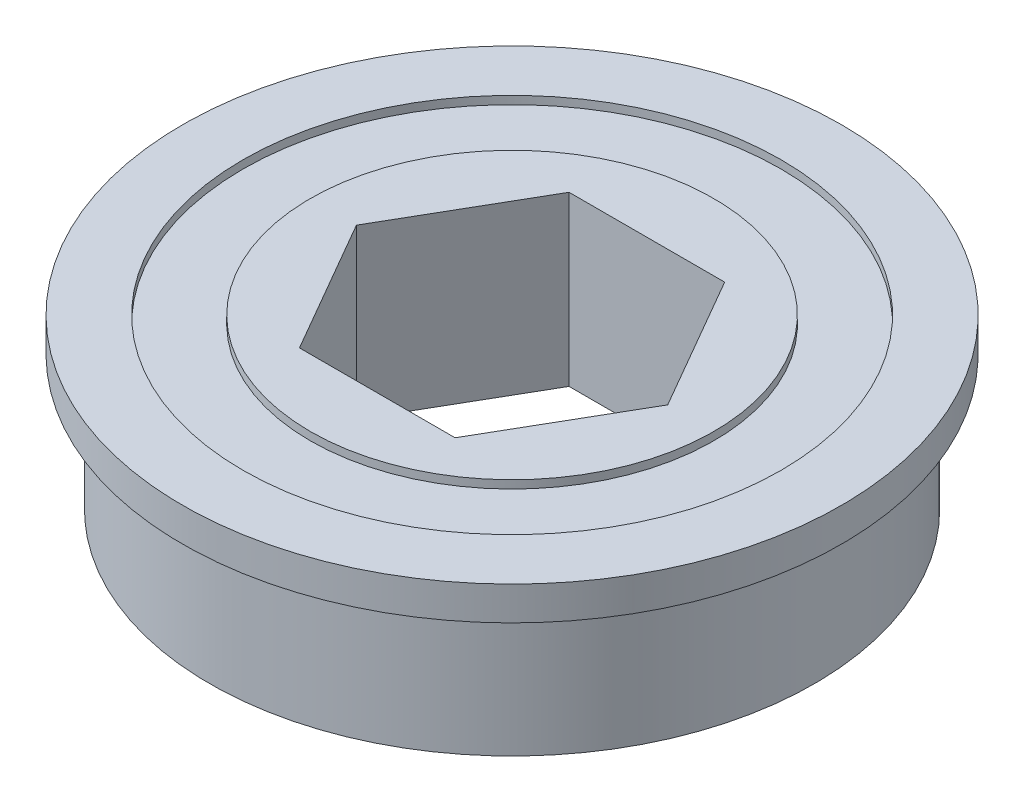
ISO-10303-21;
HEADER;
FILE_DESCRIPTION(('STEP AP214'),'2;1');
FILE_NAME('part.step','',(''),(''),'','','');
FILE_SCHEMA(('AUTOMOTIVE_DESIGN { 1 0 10303 214 1 1 1 1 }'));
ENDSEC;
DATA;
#1=APPLICATION_CONTEXT('core data for automotive mechanical design processes');
#2=APPLICATION_PROTOCOL_DEFINITION('international standard','automotive_design',2000,#1);
#3=PRODUCT_CONTEXT('',#1,'mechanical');
#4=PRODUCT('Part','Part','',(#3));
#5=PRODUCT_RELATED_PRODUCT_CATEGORY('part','',(#4));
#6=PRODUCT_DEFINITION_FORMATION('','',#4);
#7=PRODUCT_DEFINITION_CONTEXT('part definition',#1,'design');
#8=PRODUCT_DEFINITION('design','',#6,#7);
#9=PRODUCT_DEFINITION_SHAPE('','',#8);
#10=(LENGTH_UNIT() NAMED_UNIT(*) SI_UNIT(.MILLI.,.METRE.));
#11=(NAMED_UNIT(*) PLANE_ANGLE_UNIT() SI_UNIT($,.RADIAN.));
#12=(NAMED_UNIT(*) SI_UNIT($,.STERADIAN.) SOLID_ANGLE_UNIT());
#13=UNCERTAINTY_MEASURE_WITH_UNIT(LENGTH_MEASURE(1.E-05),#10,'distance_accuracy_value','');
#14=(GEOMETRIC_REPRESENTATION_CONTEXT(3) GLOBAL_UNCERTAINTY_ASSIGNED_CONTEXT((#13)) GLOBAL_UNIT_ASSIGNED_CONTEXT((#10,
#11,#12)) REPRESENTATION_CONTEXT('',''));
#15=CARTESIAN_POINT('',(0.,0.,0.));
#16=DIRECTION('',(0.,0.,1.));
#17=DIRECTION('',(1.,0.,0.));
#18=AXIS2_PLACEMENT_3D('',#15,#16,#17);
#19=CARTESIAN_POINT('',(0.,-7.9375,0.));
#20=DIRECTION('',(0.,-1.,0.));
#21=DIRECTION('',(1.,0.,0.));
#22=AXIS2_PLACEMENT_3D('',#19,#20,#21);
#23=PLANE('',#22);
#24=DIRECTION('',(-0.5,0.,-0.866025403784439));
#25=VECTOR('',#24,1.);
#26=CARTESIAN_POINT('',(5.51025983665925,-7.9375,-3.18135));
#27=LINE('',#26,#25);
#28=CARTESIAN_POINT('',(7.34701311554567,-7.9375,0.));
#29=VERTEX_POINT('',#28);
#30=CARTESIAN_POINT('',(3.67350655777283,-7.9375,-6.3627));
#31=VERTEX_POINT('',#30);
#32=EDGE_CURVE('E126',#29,#31,#27,.T.);
#33=ORIENTED_EDGE('',*,*,#32,.T.);
#34=DIRECTION('',(-1.,0.,0.));
#35=VECTOR('',#34,1.);
#36=CARTESIAN_POINT('',(0.,-7.9375,-6.3627));
#37=LINE('',#36,#35);
#38=CARTESIAN_POINT('',(-3.67350655777283,-7.9375,-6.3627));
#39=VERTEX_POINT('',#38);
#40=EDGE_CURVE('E73',#31,#39,#37,.T.);
#41=ORIENTED_EDGE('',*,*,#40,.T.);
#42=DIRECTION('',(-0.5,0.,0.866025403784439));
#43=VECTOR('',#42,1.);
#44=CARTESIAN_POINT('',(-5.51025983665925,-7.9375,-3.18135));
#45=LINE('',#44,#43);
#46=CARTESIAN_POINT('',(-7.34701311554567,-7.9375,0.));
#47=VERTEX_POINT('',#46);
#48=EDGE_CURVE('E76',#39,#47,#45,.T.);
#49=ORIENTED_EDGE('',*,*,#48,.T.);
#50=DIRECTION('',(0.5,0.,0.866025403784439));
#51=VECTOR('',#50,1.);
#52=CARTESIAN_POINT('',(-5.51025983665925,-7.9375,3.18135));
#53=LINE('',#52,#51);
#54=CARTESIAN_POINT('',(-3.67350655777283,-7.9375,6.3627));
#55=VERTEX_POINT('',#54);
#56=EDGE_CURVE('E117',#47,#55,#53,.T.);
#57=ORIENTED_EDGE('',*,*,#56,.T.);
#58=DIRECTION('',(1.,0.,0.));
#59=VECTOR('',#58,1.);
#60=CARTESIAN_POINT('',(0.,-7.9375,6.3627));
#61=LINE('',#60,#59);
#62=CARTESIAN_POINT('',(3.67350655777283,-7.9375,6.3627));
#63=VERTEX_POINT('',#62);
#64=EDGE_CURVE('E120',#55,#63,#61,.T.);
#65=ORIENTED_EDGE('',*,*,#64,.T.);
#66=DIRECTION('',(0.5,0.,-0.866025403784439));
#67=VECTOR('',#66,1.);
#68=CARTESIAN_POINT('',(5.51025983665925,-7.9375,3.18135));
#69=LINE('',#68,#67);
#70=EDGE_CURVE('E123',#63,#29,#69,.T.);
#71=ORIENTED_EDGE('',*,*,#70,.T.);
#72=EDGE_LOOP('',(#33,#41,#49,#57,#65,#71));
#73=FACE_BOUND('',#72,.T.);
#74=CARTESIAN_POINT('',(0.,-7.9375,0.));
#75=DIRECTION('',(0.,1.,0.));
#76=DIRECTION('',(0.,0.,1.));
#77=AXIS2_PLACEMENT_3D('',#74,#75,#76);
#78=CIRCLE('',#77,9.525);
#79=CARTESIAN_POINT('',(0.,-7.9375,9.525));
#80=VERTEX_POINT('',#79);
#81=EDGE_CURVE('E230',#80,#80,#78,.T.);
#82=ORIENTED_EDGE('',*,*,#81,.F.);
#83=EDGE_LOOP('',(#82));
#84=FACE_BOUND('',#83,.T.);
#85=ADVANCED_FACE('F17',(#73,#84),#23,.T.);
#86=CARTESIAN_POINT('',(0.,0.,0.));
#87=DIRECTION('',(0.,-1.,0.));
#88=DIRECTION('',(1.,0.,0.));
#89=AXIS2_PLACEMENT_3D('',#86,#87,#88);
#90=PLANE('',#89);
#91=DIRECTION('',(1.,0.,0.));
#92=VECTOR('',#91,1.);
#93=CARTESIAN_POINT('',(0.,0.,-6.3627));
#94=LINE('',#93,#92);
#95=CARTESIAN_POINT('',(-3.67350655777283,0.,-6.3627));
#96=VERTEX_POINT('',#95);
#97=CARTESIAN_POINT('',(3.67350655777283,0.,-6.3627));
#98=VERTEX_POINT('',#97);
#99=EDGE_CURVE('E40',#96,#98,#94,.T.);
#100=ORIENTED_EDGE('',*,*,#99,.T.);
#101=DIRECTION('',(0.5,0.,0.866025403784439));
#102=VECTOR('',#101,1.);
#103=CARTESIAN_POINT('',(5.51025983665925,0.,-3.18135));
#104=LINE('',#103,#102);
#105=CARTESIAN_POINT('',(7.34701311554567,0.,0.));
#106=VERTEX_POINT('',#105);
#107=EDGE_CURVE('E80',#98,#106,#104,.T.);
#108=ORIENTED_EDGE('',*,*,#107,.T.);
#109=DIRECTION('',(-0.5,0.,0.866025403784439));
#110=VECTOR('',#109,1.);
#111=CARTESIAN_POINT('',(5.51025983665925,0.,3.18135));
#112=LINE('',#111,#110);
#113=CARTESIAN_POINT('',(3.67350655777283,0.,6.3627));
#114=VERTEX_POINT('',#113);
#115=EDGE_CURVE('E86',#106,#114,#112,.T.);
#116=ORIENTED_EDGE('',*,*,#115,.T.);
#117=DIRECTION('',(-1.,0.,0.));
#118=VECTOR('',#117,1.);
#119=CARTESIAN_POINT('',(0.,0.,6.3627));
#120=LINE('',#119,#118);
#121=CARTESIAN_POINT('',(-3.67350655777283,0.,6.3627));
#122=VERTEX_POINT('',#121);
#123=EDGE_CURVE('E101',#114,#122,#120,.T.);
#124=ORIENTED_EDGE('',*,*,#123,.T.);
#125=DIRECTION('',(-0.5,0.,-0.866025403784439));
#126=VECTOR('',#125,1.);
#127=CARTESIAN_POINT('',(-5.51025983665925,0.,3.18135));
#128=LINE('',#127,#126);
#129=CARTESIAN_POINT('',(-7.34701311554567,0.,0.));
#130=VERTEX_POINT('',#129);
#131=EDGE_CURVE('E104',#122,#130,#128,.T.);
#132=ORIENTED_EDGE('',*,*,#131,.T.);
#133=DIRECTION('',(0.5,0.,-0.866025403784439));
#134=VECTOR('',#133,1.);
#135=CARTESIAN_POINT('',(-5.51025983665925,0.,-3.18135));
#136=LINE('',#135,#134);
#137=EDGE_CURVE('E92',#130,#96,#136,.T.);
#138=ORIENTED_EDGE('',*,*,#137,.T.);
#139=EDGE_LOOP('',(#100,#108,#116,#124,#132,#138));
#140=FACE_BOUND('',#139,.T.);
#141=CARTESIAN_POINT('',(0.,0.,0.));
#142=DIRECTION('',(0.,1.,0.));
#143=DIRECTION('',(0.,0.,1.));
#144=AXIS2_PLACEMENT_3D('',#141,#142,#143);
#145=CIRCLE('',#144,9.525);
#146=CARTESIAN_POINT('',(0.,0.,9.525));
#147=VERTEX_POINT('',#146);
#148=EDGE_CURVE('E222',#147,#147,#145,.T.);
#149=ORIENTED_EDGE('',*,*,#148,.T.);
#150=EDGE_LOOP('',(#149));
#151=FACE_BOUND('',#150,.T.);
#152=ADVANCED_FACE('F89',(#140,#151),#90,.F.);
#153=CARTESIAN_POINT('',(0.,-7.9375,0.));
#154=DIRECTION('',(0.,1.,0.));
#155=DIRECTION('',(0.,0.,1.));
#156=AXIS2_PLACEMENT_3D('',#153,#154,#155);
#157=CIRCLE('',#156,12.7);
#158=CARTESIAN_POINT('',(0.,-7.9375,12.7));
#159=VERTEX_POINT('',#158);
#160=EDGE_CURVE('E227',#159,#159,#157,.T.);
#161=ORIENTED_EDGE('',*,*,#160,.T.);
#162=EDGE_LOOP('',(#161));
#163=FACE_BOUND('',#162,.T.);
#164=CARTESIAN_POINT('',(0.,-7.9375,0.));
#165=DIRECTION('',(0.,-1.,0.));
#166=DIRECTION('',(0.,0.,-1.));
#167=AXIS2_PLACEMENT_3D('',#164,#165,#166);
#168=CIRCLE('',#167,14.2748);
#169=CARTESIAN_POINT('',(0.,-7.9375,-14.2748));
#170=VERTEX_POINT('',#169);
#171=EDGE_CURVE('E11',#170,#170,#168,.T.);
#172=ORIENTED_EDGE('',*,*,#171,.T.);
#173=EDGE_LOOP('',(#172));
#174=FACE_BOUND('',#173,.T.);
#175=ADVANCED_FACE('F138',(#163,#174),#23,.T.);
#176=CARTESIAN_POINT('',(0.,0.,0.));
#177=DIRECTION('',(0.,1.,0.));
#178=DIRECTION('',(0.,0.,1.));
#179=AXIS2_PLACEMENT_3D('',#176,#177,#178);
#180=CIRCLE('',#179,12.7);
#181=CARTESIAN_POINT('',(0.,0.,12.7));
#182=VERTEX_POINT('',#181);
#183=EDGE_CURVE('E225',#182,#182,#180,.T.);
#184=ORIENTED_EDGE('',*,*,#183,.F.);
#185=EDGE_LOOP('',(#184));
#186=FACE_BOUND('',#185,.T.);
#187=CARTESIAN_POINT('',(0.,0.,0.));
#188=DIRECTION('',(0.,-1.,0.));
#189=DIRECTION('',(0.,0.,-1.));
#190=AXIS2_PLACEMENT_3D('',#187,#188,#189);
#191=CIRCLE('',#190,15.5575);
#192=CARTESIAN_POINT('',(0.,0.,-15.5575));
#193=VERTEX_POINT('',#192);
#194=EDGE_CURVE('E129',#193,#193,#191,.T.);
#195=ORIENTED_EDGE('',*,*,#194,.F.);
#196=EDGE_LOOP('',(#195));
#197=FACE_BOUND('',#196,.T.);
#198=ADVANCED_FACE('F136',(#186,#197),#90,.F.);
#199=CARTESIAN_POINT('',(0.,-7.9375,0.));
#200=DIRECTION('',(0.,1.,0.));
#201=DIRECTION('',(0.,0.,1.));
#202=AXIS2_PLACEMENT_3D('',#199,#200,#201);
#203=CYLINDRICAL_SURFACE('',#202,14.2748);
#204=CARTESIAN_POINT('',(0.,-2.3495,0.));
#205=DIRECTION('',(0.,-1.,0.));
#206=DIRECTION('',(0.,0.,-1.));
#207=AXIS2_PLACEMENT_3D('',#204,#205,#206);
#208=CIRCLE('',#207,14.2748);
#209=CARTESIAN_POINT('',(0.,-2.3495,-14.2748));
#210=VERTEX_POINT('',#209);
#211=EDGE_CURVE('E93',#210,#210,#208,.T.);
#212=ORIENTED_EDGE('',*,*,#211,.T.);
#213=EDGE_LOOP('',(#212));
#214=FACE_BOUND('',#213,.T.);
#215=ORIENTED_EDGE('',*,*,#171,.F.);
#216=EDGE_LOOP('',(#215));
#217=FACE_BOUND('',#216,.T.);
#218=ADVANCED_FACE('F19',(#214,#217),#203,.T.);
#219=CARTESIAN_POINT('',(0.,-1.5875,0.));
#220=DIRECTION('',(0.,1.,0.));
#221=DIRECTION('',(0.,0.,1.));
#222=AXIS2_PLACEMENT_3D('',#219,#220,#221);
#223=CYLINDRICAL_SURFACE('',#222,15.5575);
#224=CARTESIAN_POINT('',(0.,-1.5875,0.));
#225=DIRECTION('',(0.,-1.,0.));
#226=DIRECTION('',(0.,0.,-1.));
#227=AXIS2_PLACEMENT_3D('',#224,#225,#226);
#228=CIRCLE('',#227,15.5575);
#229=CARTESIAN_POINT('',(0.,-1.5875,-15.5575));
#230=VERTEX_POINT('',#229);
#231=EDGE_CURVE('E25',#230,#230,#228,.T.);
#232=ORIENTED_EDGE('',*,*,#231,.F.);
#233=EDGE_LOOP('',(#232));
#234=FACE_BOUND('',#233,.T.);
#235=ORIENTED_EDGE('',*,*,#194,.T.);
#236=EDGE_LOOP('',(#235));
#237=FACE_BOUND('',#236,.T.);
#238=ADVANCED_FACE('F134',(#234,#237),#223,.T.);
#239=CARTESIAN_POINT('',(0.,-1.5875,0.));
#240=DIRECTION('',(0.,-1.,0.));
#241=DIRECTION('',(1.,0.,0.));
#242=AXIS2_PLACEMENT_3D('',#239,#240,#241);
#243=PLANE('',#242);
#244=CARTESIAN_POINT('',(0.,-1.5875,0.));
#245=DIRECTION('',(0.,-1.,0.));
#246=DIRECTION('',(0.,0.,-1.));
#247=AXIS2_PLACEMENT_3D('',#244,#245,#246);
#248=CIRCLE('',#247,14.2748);
#249=CARTESIAN_POINT('',(0.,-1.5875,-14.2748));
#250=VERTEX_POINT('',#249);
#251=EDGE_CURVE('E240',#250,#250,#248,.T.);
#252=ORIENTED_EDGE('',*,*,#251,.F.);
#253=EDGE_LOOP('',(#252));
#254=FACE_BOUND('',#253,.T.);
#255=ORIENTED_EDGE('',*,*,#231,.T.);
#256=EDGE_LOOP('',(#255));
#257=FACE_BOUND('',#256,.T.);
#258=ADVANCED_FACE('F158',(#254,#257),#243,.T.);
#259=CARTESIAN_POINT('',(0.,-44.7234247877525,-6.3627));
#260=DIRECTION('',(0.,0.,1.));
#261=DIRECTION('',(1.,0.,0.));
#262=AXIS2_PLACEMENT_3D('',#259,#260,#261);
#263=PLANE('',#262);
#264=DIRECTION('',(0.,1.,0.));
#265=VECTOR('',#264,1.);
#266=CARTESIAN_POINT('',(3.67350655777283,-44.7234247877525,-6.3627));
#267=LINE('',#266,#265);
#268=EDGE_CURVE('E69',#31,#98,#267,.T.);
#269=ORIENTED_EDGE('',*,*,#268,.T.);
#270=ORIENTED_EDGE('',*,*,#99,.F.);
#271=DIRECTION('',(0.,1.,0.));
#272=VECTOR('',#271,1.);
#273=CARTESIAN_POINT('',(-3.67350655777283,-44.7234247877525,-6.3627));
#274=LINE('',#273,#272);
#275=EDGE_CURVE('E107',#39,#96,#274,.T.);
#276=ORIENTED_EDGE('',*,*,#275,.F.);
#277=ORIENTED_EDGE('',*,*,#40,.F.);
#278=EDGE_LOOP('',(#269,#270,#276,#277));
#279=FACE_BOUND('',#278,.T.);
#280=ADVANCED_FACE('F71',(#279),#263,.T.);
#281=CARTESIAN_POINT('',(5.51025983665925,-44.7234247877525,-3.18135));
#282=DIRECTION('',(-0.866025403784439,0.,0.5));
#283=DIRECTION('',(0.5,0.,0.866025403784439));
#284=AXIS2_PLACEMENT_3D('',#281,#282,#283);
#285=PLANE('',#284);
#286=DIRECTION('',(0.,1.,0.));
#287=VECTOR('',#286,1.);
#288=CARTESIAN_POINT('',(7.34701311554567,-44.7234247877525,0.));
#289=LINE('',#288,#287);
#290=EDGE_CURVE('E77',#29,#106,#289,.T.);
#291=ORIENTED_EDGE('',*,*,#290,.T.);
#292=ORIENTED_EDGE('',*,*,#107,.F.);
#293=ORIENTED_EDGE('',*,*,#268,.F.);
#294=ORIENTED_EDGE('',*,*,#32,.F.);
#295=EDGE_LOOP('',(#291,#292,#293,#294));
#296=FACE_BOUND('',#295,.T.);
#297=ADVANCED_FACE('F81',(#296),#285,.T.);
#298=CARTESIAN_POINT('',(5.51025983665925,-44.7234247877525,3.18135));
#299=DIRECTION('',(-0.866025403784439,0.,-0.5));
#300=DIRECTION('',(-0.5,0.,0.866025403784439));
#301=AXIS2_PLACEMENT_3D('',#298,#299,#300);
#302=PLANE('',#301);
#303=DIRECTION('',(0.,1.,0.));
#304=VECTOR('',#303,1.);
#305=CARTESIAN_POINT('',(3.67350655777283,-44.7234247877525,6.3627));
#306=LINE('',#305,#304);
#307=EDGE_CURVE('E112',#63,#114,#306,.T.);
#308=ORIENTED_EDGE('',*,*,#307,.T.);
#309=ORIENTED_EDGE('',*,*,#115,.F.);
#310=ORIENTED_EDGE('',*,*,#290,.F.);
#311=ORIENTED_EDGE('',*,*,#70,.F.);
#312=EDGE_LOOP('',(#308,#309,#310,#311));
#313=FACE_BOUND('',#312,.T.);
#314=ADVANCED_FACE('F167',(#313),#302,.T.);
#315=CARTESIAN_POINT('',(0.,-44.7234247877525,6.3627));
#316=DIRECTION('',(0.,0.,-1.));
#317=DIRECTION('',(-1.,0.,0.));
#318=AXIS2_PLACEMENT_3D('',#315,#316,#317);
#319=PLANE('',#318);
#320=DIRECTION('',(0.,1.,0.));
#321=VECTOR('',#320,1.);
#322=CARTESIAN_POINT('',(-3.67350655777283,-44.7234247877525,6.3627));
#323=LINE('',#322,#321);
#324=EDGE_CURVE('E110',#55,#122,#323,.T.);
#325=ORIENTED_EDGE('',*,*,#324,.T.);
#326=ORIENTED_EDGE('',*,*,#123,.F.);
#327=ORIENTED_EDGE('',*,*,#307,.F.);
#328=ORIENTED_EDGE('',*,*,#64,.F.);
#329=EDGE_LOOP('',(#325,#326,#327,#328));
#330=FACE_BOUND('',#329,.T.);
#331=ADVANCED_FACE('F170',(#330),#319,.T.);
#332=CARTESIAN_POINT('',(-5.51025983665925,-44.7234247877525,3.18135));
#333=DIRECTION('',(0.866025403784439,0.,-0.5));
#334=DIRECTION('',(-0.5,0.,-0.866025403784439));
#335=AXIS2_PLACEMENT_3D('',#332,#333,#334);
#336=PLANE('',#335);
#337=DIRECTION('',(0.,1.,0.));
#338=VECTOR('',#337,1.);
#339=CARTESIAN_POINT('',(-7.34701311554567,-44.7234247877525,0.));
#340=LINE('',#339,#338);
#341=EDGE_CURVE('E32',#47,#130,#340,.T.);
#342=ORIENTED_EDGE('',*,*,#341,.T.);
#343=ORIENTED_EDGE('',*,*,#131,.F.);
#344=ORIENTED_EDGE('',*,*,#324,.F.);
#345=ORIENTED_EDGE('',*,*,#56,.F.);
#346=EDGE_LOOP('',(#342,#343,#344,#345));
#347=FACE_BOUND('',#346,.T.);
#348=ADVANCED_FACE('F174',(#347),#336,.T.);
#349=CARTESIAN_POINT('',(-5.51025983665925,-44.7234247877525,-3.18135));
#350=DIRECTION('',(0.866025403784439,0.,0.5));
#351=DIRECTION('',(0.5,0.,-0.866025403784439));
#352=AXIS2_PLACEMENT_3D('',#349,#350,#351);
#353=PLANE('',#352);
#354=ORIENTED_EDGE('',*,*,#275,.T.);
#355=ORIENTED_EDGE('',*,*,#137,.F.);
#356=ORIENTED_EDGE('',*,*,#341,.F.);
#357=ORIENTED_EDGE('',*,*,#48,.F.);
#358=EDGE_LOOP('',(#354,#355,#356,#357));
#359=FACE_BOUND('',#358,.T.);
#360=ADVANCED_FACE('F178',(#359),#353,.T.);
#361=CARTESIAN_POINT('',(0.,-1.9685,0.));
#362=DIRECTION('',(0.,-1.,0.));
#363=DIRECTION('',(0.,0.,-1.));
#364=AXIS2_PLACEMENT_3D('',#361,#362,#363);
#365=CONICAL_SURFACE('',#364,14.0548295474387,0.5235987755983);
#366=ORIENTED_EDGE('',*,*,#211,.F.);
#367=EDGE_LOOP('',(#366));
#368=FACE_BOUND('',#367,.T.);
#369=CARTESIAN_POINT('',(0.,-1.9685,0.));
#370=DIRECTION('',(0.,-1.,0.));
#371=DIRECTION('',(0.,0.,-1.));
#372=AXIS2_PLACEMENT_3D('',#369,#370,#371);
#373=CIRCLE('',#372,14.0548295474387);
#374=CARTESIAN_POINT('',(0.,-1.9685,-14.0548295474387));
#375=VERTEX_POINT('',#374);
#376=EDGE_CURVE('E96',#375,#375,#373,.T.);
#377=ORIENTED_EDGE('',*,*,#376,.T.);
#378=EDGE_LOOP('',(#377));
#379=FACE_BOUND('',#378,.T.);
#380=ADVANCED_FACE('F182',(#368,#379),#365,.T.);
#381=CARTESIAN_POINT('',(0.,-1.8415,0.));
#382=DIRECTION('',(0.,-1.,0.));
#383=DIRECTION('',(0.,0.,-1.));
#384=AXIS2_PLACEMENT_3D('',#381,#382,#383);
#385=TOROIDAL_SURFACE('',#384,14.2748,0.254);
#386=ORIENTED_EDGE('',*,*,#251,.T.);
#387=EDGE_LOOP('',(#386));
#388=FACE_BOUND('',#387,.T.);
#389=ORIENTED_EDGE('',*,*,#376,.F.);
#390=EDGE_LOOP('',(#389));
#391=FACE_BOUND('',#390,.T.);
#392=ADVANCED_FACE('F185',(#388,#391),#385,.F.);
#393=CARTESIAN_POINT('',(0.,-0.381,0.));
#394=DIRECTION('',(0.,1.,0.));
#395=DIRECTION('',(0.,0.,1.));
#396=AXIS2_PLACEMENT_3D('',#393,#394,#395);
#397=CYLINDRICAL_SURFACE('',#396,9.525);
#398=CARTESIAN_POINT('',(0.,-0.381,0.));
#399=DIRECTION('',(0.,1.,0.));
#400=DIRECTION('',(0.,0.,1.));
#401=AXIS2_PLACEMENT_3D('',#398,#399,#400);
#402=CIRCLE('',#401,9.525);
#403=CARTESIAN_POINT('',(0.,-0.381,9.525));
#404=VERTEX_POINT('',#403);
#405=EDGE_CURVE('E235',#404,#404,#402,.T.);
#406=ORIENTED_EDGE('',*,*,#405,.T.);
#407=EDGE_LOOP('',(#406));
#408=FACE_BOUND('',#407,.T.);
#409=ORIENTED_EDGE('',*,*,#148,.F.);
#410=EDGE_LOOP('',(#409));
#411=FACE_BOUND('',#410,.T.);
#412=ADVANCED_FACE('F189',(#408,#411),#397,.T.);
#413=CARTESIAN_POINT('',(0.,-0.381,0.));
#414=DIRECTION('',(0.,1.,0.));
#415=DIRECTION('',(0.,0.,1.));
#416=AXIS2_PLACEMENT_3D('',#413,#414,#415);
#417=CYLINDRICAL_SURFACE('',#416,12.7);
#418=CARTESIAN_POINT('',(0.,-0.381,0.));
#419=DIRECTION('',(0.,1.,0.));
#420=DIRECTION('',(0.,0.,1.));
#421=AXIS2_PLACEMENT_3D('',#418,#419,#420);
#422=CIRCLE('',#421,12.7);
#423=CARTESIAN_POINT('',(0.,-0.381,12.7));
#424=VERTEX_POINT('',#423);
#425=EDGE_CURVE('E238',#424,#424,#422,.T.);
#426=ORIENTED_EDGE('',*,*,#425,.F.);
#427=EDGE_LOOP('',(#426));
#428=FACE_BOUND('',#427,.T.);
#429=ORIENTED_EDGE('',*,*,#183,.T.);
#430=EDGE_LOOP('',(#429));
#431=FACE_BOUND('',#430,.T.);
#432=ADVANCED_FACE('F193',(#428,#431),#417,.F.);
#433=CARTESIAN_POINT('',(0.,-0.381,0.));
#434=DIRECTION('',(0.,1.,0.));
#435=DIRECTION('',(-1.,0.,0.));
#436=AXIS2_PLACEMENT_3D('',#433,#434,#435);
#437=PLANE('',#436);
#438=ORIENTED_EDGE('',*,*,#405,.F.);
#439=EDGE_LOOP('',(#438));
#440=FACE_BOUND('',#439,.T.);
#441=ORIENTED_EDGE('',*,*,#425,.T.);
#442=EDGE_LOOP('',(#441));
#443=FACE_BOUND('',#442,.T.);
#444=ADVANCED_FACE('F197',(#440,#443),#437,.T.);
#445=CARTESIAN_POINT('',(0.,-7.5565,0.));
#446=DIRECTION('',(0.,-1.,0.));
#447=DIRECTION('',(0.,0.,-1.));
#448=AXIS2_PLACEMENT_3D('',#445,#446,#447);
#449=CYLINDRICAL_SURFACE('',#448,9.525);
#450=CARTESIAN_POINT('',(0.,-7.5565,0.));
#451=DIRECTION('',(0.,1.,0.));
#452=DIRECTION('',(0.,0.,1.));
#453=AXIS2_PLACEMENT_3D('',#450,#451,#452);
#454=CIRCLE('',#453,9.525);
#455=CARTESIAN_POINT('',(0.,-7.5565,9.525));
#456=VERTEX_POINT('',#455);
#457=EDGE_CURVE('E218',#456,#456,#454,.T.);
#458=ORIENTED_EDGE('',*,*,#457,.F.);
#459=EDGE_LOOP('',(#458));
#460=FACE_BOUND('',#459,.T.);
#461=ORIENTED_EDGE('',*,*,#81,.T.);
#462=EDGE_LOOP('',(#461));
#463=FACE_BOUND('',#462,.T.);
#464=ADVANCED_FACE('F201',(#460,#463),#449,.T.);
#465=CARTESIAN_POINT('',(0.,-7.5565,0.));
#466=DIRECTION('',(0.,-1.,0.));
#467=DIRECTION('',(0.,0.,-1.));
#468=AXIS2_PLACEMENT_3D('',#465,#466,#467);
#469=CYLINDRICAL_SURFACE('',#468,12.7);
#470=CARTESIAN_POINT('',(0.,-7.5565,0.));
#471=DIRECTION('',(0.,1.,0.));
#472=DIRECTION('',(0.,0.,1.));
#473=AXIS2_PLACEMENT_3D('',#470,#471,#472);
#474=CIRCLE('',#473,12.7);
#475=CARTESIAN_POINT('',(0.,-7.5565,12.7));
#476=VERTEX_POINT('',#475);
#477=EDGE_CURVE('E221',#476,#476,#474,.T.);
#478=ORIENTED_EDGE('',*,*,#477,.T.);
#479=EDGE_LOOP('',(#478));
#480=FACE_BOUND('',#479,.T.);
#481=ORIENTED_EDGE('',*,*,#160,.F.);
#482=EDGE_LOOP('',(#481));
#483=FACE_BOUND('',#482,.T.);
#484=ADVANCED_FACE('F205',(#480,#483),#469,.F.);
#485=CARTESIAN_POINT('',(0.,-7.5565,0.));
#486=DIRECTION('',(0.,-1.,0.));
#487=DIRECTION('',(-1.,0.,0.));
#488=AXIS2_PLACEMENT_3D('',#485,#486,#487);
#489=PLANE('',#488);
#490=ORIENTED_EDGE('',*,*,#457,.T.);
#491=EDGE_LOOP('',(#490));
#492=FACE_BOUND('',#491,.T.);
#493=ORIENTED_EDGE('',*,*,#477,.F.);
#494=EDGE_LOOP('',(#493));
#495=FACE_BOUND('',#494,.T.);
#496=ADVANCED_FACE('F209',(#492,#495),#489,.T.);
#497=CLOSED_SHELL('',(#85,#152,#175,#198,#218,#238,#258,#280,#297,#314,#331,#348,#360,#380,#392,
#412,#432,#444,#464,#484,#496));
#498=MANIFOLD_SOLID_BREP('B1',#497);
#499=ADVANCED_BREP_SHAPE_REPRESENTATION('',(#18,#498),#14);
#500=SHAPE_DEFINITION_REPRESENTATION(#9,#499);
ENDSEC;
END-ISO-10303-21;
